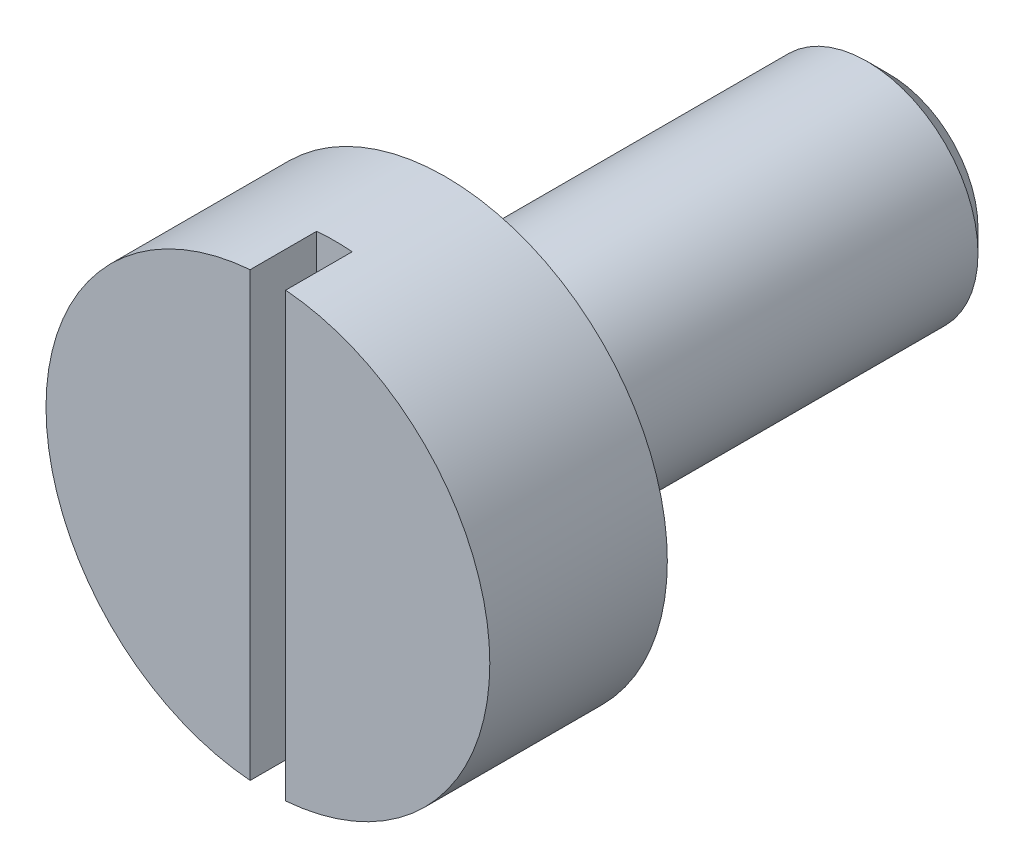
ISO-10303-21;
HEADER;
FILE_DESCRIPTION(('STEP AP214'),'2;1');
FILE_NAME('part.step','',(''),(''),'','','');
FILE_SCHEMA(('AUTOMOTIVE_DESIGN { 1 0 10303 214 1 1 1 1 }'));
ENDSEC;
DATA;
#1=APPLICATION_CONTEXT('core data for automotive mechanical design processes');
#2=APPLICATION_PROTOCOL_DEFINITION('international standard','automotive_design',2000,#1);
#3=PRODUCT_CONTEXT('',#1,'mechanical');
#4=PRODUCT('Part','Part','',(#3));
#5=PRODUCT_RELATED_PRODUCT_CATEGORY('part','',(#4));
#6=PRODUCT_DEFINITION_FORMATION('','',#4);
#7=PRODUCT_DEFINITION_CONTEXT('part definition',#1,'design');
#8=PRODUCT_DEFINITION('design','',#6,#7);
#9=PRODUCT_DEFINITION_SHAPE('','',#8);
#10=(LENGTH_UNIT() NAMED_UNIT(*) SI_UNIT(.MILLI.,.METRE.));
#11=(NAMED_UNIT(*) PLANE_ANGLE_UNIT() SI_UNIT($,.RADIAN.));
#12=(NAMED_UNIT(*) SI_UNIT($,.STERADIAN.) SOLID_ANGLE_UNIT());
#13=UNCERTAINTY_MEASURE_WITH_UNIT(LENGTH_MEASURE(1.E-05),#10,'distance_accuracy_value','');
#14=(GEOMETRIC_REPRESENTATION_CONTEXT(3) GLOBAL_UNCERTAINTY_ASSIGNED_CONTEXT((#13)) GLOBAL_UNIT_ASSIGNED_CONTEXT((#10,
#11,#12)) REPRESENTATION_CONTEXT('',''));
#15=CARTESIAN_POINT('',(0.,0.,0.));
#16=DIRECTION('',(0.,0.,1.));
#17=DIRECTION('',(1.,0.,0.));
#18=AXIS2_PLACEMENT_3D('',#15,#16,#17);
#19=CARTESIAN_POINT('',(0.,0.,14.));
#20=DIRECTION('',(0.,0.,1.));
#21=DIRECTION('',(1.,0.,0.));
#22=AXIS2_PLACEMENT_3D('',#19,#20,#21);
#23=PLANE('',#22);
#24=DIRECTION('',(0.,-1.,0.));
#25=VECTOR('',#24,1.);
#26=CARTESIAN_POINT('',(-0.399999999999999,0.,14.));
#27=LINE('',#26,#25);
#28=CARTESIAN_POINT('',(-0.399999999999999,4.98397431775085,14.));
#29=VERTEX_POINT('',#28);
#30=CARTESIAN_POINT('',(-0.399999999999999,-4.98397431775085,14.));
#31=VERTEX_POINT('',#30);
#32=EDGE_CURVE('E76',#29,#31,#27,.T.);
#33=ORIENTED_EDGE('',*,*,#32,.F.);
#34=CARTESIAN_POINT('',(0.,0.,14.));
#35=DIRECTION('',(0.,0.,1.));
#36=DIRECTION('',(1.,0.,0.));
#37=AXIS2_PLACEMENT_3D('',#34,#35,#36);
#38=CIRCLE('',#37,5.);
#39=EDGE_CURVE('E90',#29,#31,#38,.T.);
#40=ORIENTED_EDGE('',*,*,#39,.T.);
#41=EDGE_LOOP('',(#33,#40));
#42=FACE_BOUND('',#41,.T.);
#43=ADVANCED_FACE('F28',(#42),#23,.T.);
#44=CARTESIAN_POINT('',(0.,0.,10.));
#45=DIRECTION('',(0.,0.,-1.));
#46=DIRECTION('',(-1.,0.,0.));
#47=AXIS2_PLACEMENT_3D('',#44,#45,#46);
#48=CYLINDRICAL_SURFACE('',#47,2.5);
#49=CARTESIAN_POINT('',(0.,0.,0.499999999999999));
#50=DIRECTION('',(0.,0.,1.));
#51=DIRECTION('',(1.,0.,0.));
#52=AXIS2_PLACEMENT_3D('',#49,#50,#51);
#53=CIRCLE('',#52,2.5);
#54=CARTESIAN_POINT('',(2.5,0.,0.499999999999999));
#55=VERTEX_POINT('',#54);
#56=EDGE_CURVE('E36',#55,#55,#53,.T.);
#57=ORIENTED_EDGE('',*,*,#56,.T.);
#58=EDGE_LOOP('',(#57));
#59=FACE_BOUND('',#58,.T.);
#60=CARTESIAN_POINT('',(0.,0.,10.));
#61=DIRECTION('',(0.,0.,1.));
#62=DIRECTION('',(1.,0.,0.));
#63=AXIS2_PLACEMENT_3D('',#60,#61,#62);
#64=CIRCLE('',#63,2.5);
#65=CARTESIAN_POINT('',(2.5,0.,10.));
#66=VERTEX_POINT('',#65);
#67=EDGE_CURVE('E77',#66,#66,#64,.T.);
#68=ORIENTED_EDGE('',*,*,#67,.F.);
#69=EDGE_LOOP('',(#68));
#70=FACE_BOUND('',#69,.T.);
#71=ADVANCED_FACE('F30',(#59,#70),#48,.T.);
#72=CARTESIAN_POINT('',(0.,0.,0.));
#73=DIRECTION('',(0.,0.,1.));
#74=DIRECTION('',(1.,0.,0.));
#75=AXIS2_PLACEMENT_3D('',#72,#73,#74);
#76=PLANE('',#75);
#77=CARTESIAN_POINT('',(0.,0.,0.));
#78=DIRECTION('',(0.,0.,1.));
#79=DIRECTION('',(1.,0.,0.));
#80=AXIS2_PLACEMENT_3D('',#77,#78,#79);
#81=CIRCLE('',#80,2.);
#82=CARTESIAN_POINT('',(2.,0.,0.));
#83=VERTEX_POINT('',#82);
#84=EDGE_CURVE('E11',#83,#83,#81,.F.);
#85=ORIENTED_EDGE('',*,*,#84,.T.);
#86=EDGE_LOOP('',(#85));
#87=FACE_BOUND('',#86,.T.);
#88=ADVANCED_FACE('F126',(#87),#76,.F.);
#89=CARTESIAN_POINT('',(0.,0.,10.));
#90=DIRECTION('',(0.,0.,1.));
#91=DIRECTION('',(1.,0.,0.));
#92=AXIS2_PLACEMENT_3D('',#89,#90,#91);
#93=PLANE('',#92);
#94=CARTESIAN_POINT('',(0.,0.,10.));
#95=DIRECTION('',(0.,0.,1.));
#96=DIRECTION('',(1.,0.,0.));
#97=AXIS2_PLACEMENT_3D('',#94,#95,#96);
#98=CIRCLE('',#97,5.);
#99=CARTESIAN_POINT('',(5.,0.,10.));
#100=VERTEX_POINT('',#99);
#101=EDGE_CURVE('E91',#100,#100,#98,.T.);
#102=ORIENTED_EDGE('',*,*,#101,.F.);
#103=EDGE_LOOP('',(#102));
#104=FACE_BOUND('',#103,.T.);
#105=ORIENTED_EDGE('',*,*,#67,.T.);
#106=EDGE_LOOP('',(#105));
#107=FACE_BOUND('',#106,.T.);
#108=ADVANCED_FACE('F137',(#104,#107),#93,.F.);
#109=CARTESIAN_POINT('',(0.,0.,14.));
#110=DIRECTION('',(0.,0.,-1.));
#111=DIRECTION('',(-1.,0.,0.));
#112=AXIS2_PLACEMENT_3D('',#109,#110,#111);
#113=CYLINDRICAL_SURFACE('',#112,5.);
#114=ORIENTED_EDGE('',*,*,#39,.F.);
#115=DIRECTION('',(0.,0.,-1.));
#116=VECTOR('',#115,1.);
#117=CARTESIAN_POINT('',(-0.399999999999999,4.98397431775085,14.));
#118=LINE('',#117,#116);
#119=CARTESIAN_POINT('',(-0.399999999999999,4.98397431775085,12.5));
#120=VERTEX_POINT('',#119);
#121=EDGE_CURVE('E95',#29,#120,#118,.T.);
#122=ORIENTED_EDGE('',*,*,#121,.T.);
#123=CARTESIAN_POINT('',(0.,0.,12.5));
#124=DIRECTION('',(0.,0.,-1.));
#125=DIRECTION('',(-1.,0.,0.));
#126=AXIS2_PLACEMENT_3D('',#123,#124,#125);
#127=CIRCLE('',#126,5.);
#128=CARTESIAN_POINT('',(0.399999999999998,4.98397431775085,12.5));
#129=VERTEX_POINT('',#128);
#130=EDGE_CURVE('E86',#120,#129,#127,.T.);
#131=ORIENTED_EDGE('',*,*,#130,.T.);
#132=DIRECTION('',(0.,0.,-1.));
#133=VECTOR('',#132,1.);
#134=CARTESIAN_POINT('',(0.399999999999998,4.98397431775085,14.));
#135=LINE('',#134,#133);
#136=CARTESIAN_POINT('',(0.399999999999998,4.98397431775085,14.));
#137=VERTEX_POINT('',#136);
#138=EDGE_CURVE('E71',#129,#137,#135,.F.);
#139=ORIENTED_EDGE('',*,*,#138,.T.);
#140=CARTESIAN_POINT('',(0.400000000000001,-4.98397431775085,14.));
#141=VERTEX_POINT('',#140);
#142=EDGE_CURVE('E84',#141,#137,#38,.T.);
#143=ORIENTED_EDGE('',*,*,#142,.F.);
#144=DIRECTION('',(0.,0.,-1.));
#145=VECTOR('',#144,1.);
#146=CARTESIAN_POINT('',(0.400000000000001,-4.98397431775085,14.));
#147=LINE('',#146,#145);
#148=CARTESIAN_POINT('',(0.400000000000001,-4.98397431775085,12.5));
#149=VERTEX_POINT('',#148);
#150=EDGE_CURVE('E43',#141,#149,#147,.T.);
#151=ORIENTED_EDGE('',*,*,#150,.T.);
#152=CARTESIAN_POINT('',(-0.399999999999999,-4.98397431775085,12.5));
#153=VERTEX_POINT('',#152);
#154=EDGE_CURVE('E102',#149,#153,#127,.T.);
#155=ORIENTED_EDGE('',*,*,#154,.T.);
#156=DIRECTION('',(0.,0.,-1.));
#157=VECTOR('',#156,1.);
#158=CARTESIAN_POINT('',(-0.399999999999999,-4.98397431775085,14.));
#159=LINE('',#158,#157);
#160=EDGE_CURVE('E51',#153,#31,#159,.F.);
#161=ORIENTED_EDGE('',*,*,#160,.T.);
#162=EDGE_LOOP('',(#114,#122,#131,#139,#143,#151,#155,#161));
#163=FACE_BOUND('',#162,.T.);
#164=ORIENTED_EDGE('',*,*,#101,.T.);
#165=EDGE_LOOP('',(#164));
#166=FACE_BOUND('',#165,.T.);
#167=ADVANCED_FACE('F82',(#163,#166),#113,.T.);
#168=DIRECTION('',(0.,1.,0.));
#169=VECTOR('',#168,1.);
#170=CARTESIAN_POINT('',(0.4,0.,14.));
#171=LINE('',#170,#169);
#172=EDGE_CURVE('E68',#141,#137,#171,.T.);
#173=ORIENTED_EDGE('',*,*,#172,.F.);
#174=ORIENTED_EDGE('',*,*,#142,.T.);
#175=EDGE_LOOP('',(#173,#174));
#176=FACE_BOUND('',#175,.T.);
#177=ADVANCED_FACE('F89',(#176),#23,.T.);
#178=CARTESIAN_POINT('',(-0.399999999999999,5.79157588961515,12.5));
#179=DIRECTION('',(0.,0.,-1.));
#180=DIRECTION('',(-1.,0.,0.));
#181=AXIS2_PLACEMENT_3D('',#178,#179,#180);
#182=PLANE('',#181);
#183=DIRECTION('',(0.,-1.,0.));
#184=VECTOR('',#183,1.);
#185=CARTESIAN_POINT('',(-0.399999999999999,-5.61405632211728,12.5));
#186=LINE('',#185,#184);
#187=EDGE_CURVE('E202',#120,#153,#186,.T.);
#188=ORIENTED_EDGE('',*,*,#187,.T.);
#189=ORIENTED_EDGE('',*,*,#154,.F.);
#190=DIRECTION('',(0.,1.,0.));
#191=VECTOR('',#190,1.);
#192=CARTESIAN_POINT('',(0.400000000000001,-5.61405632211728,12.5));
#193=LINE('',#192,#191);
#194=EDGE_CURVE('E87',#149,#129,#193,.T.);
#195=ORIENTED_EDGE('',*,*,#194,.T.);
#196=ORIENTED_EDGE('',*,*,#130,.F.);
#197=EDGE_LOOP('',(#188,#189,#195,#196));
#198=FACE_BOUND('',#197,.T.);
#199=ADVANCED_FACE('F131',(#198),#182,.F.);
#200=CARTESIAN_POINT('',(-0.399999999999999,-5.61405632211728,12.5));
#201=DIRECTION('',(-1.,0.,0.));
#202=DIRECTION('',(0.,0.,1.));
#203=AXIS2_PLACEMENT_3D('',#200,#201,#202);
#204=PLANE('',#203);
#205=ORIENTED_EDGE('',*,*,#32,.T.);
#206=ORIENTED_EDGE('',*,*,#160,.F.);
#207=ORIENTED_EDGE('',*,*,#187,.F.);
#208=ORIENTED_EDGE('',*,*,#121,.F.);
#209=EDGE_LOOP('',(#205,#206,#207,#208));
#210=FACE_BOUND('',#209,.T.);
#211=ADVANCED_FACE('F116',(#210),#204,.F.);
#212=CARTESIAN_POINT('',(0.400000000000001,-5.61405632211728,12.5));
#213=DIRECTION('',(1.,0.,0.));
#214=DIRECTION('',(0.,1.,0.));
#215=AXIS2_PLACEMENT_3D('',#212,#213,#214);
#216=PLANE('',#215);
#217=ORIENTED_EDGE('',*,*,#172,.T.);
#218=ORIENTED_EDGE('',*,*,#138,.F.);
#219=ORIENTED_EDGE('',*,*,#194,.F.);
#220=ORIENTED_EDGE('',*,*,#150,.F.);
#221=EDGE_LOOP('',(#217,#218,#219,#220));
#222=FACE_BOUND('',#221,.T.);
#223=ADVANCED_FACE('F70',(#222),#216,.F.);
#224=CARTESIAN_POINT('',(0.,0.,0.499999999999999));
#225=DIRECTION('',(0.,0.,1.));
#226=DIRECTION('',(1.,0.,0.));
#227=AXIS2_PLACEMENT_3D('',#224,#225,#226);
#228=CONICAL_SURFACE('',#227,2.5,0.785398163397451);
#229=ORIENTED_EDGE('',*,*,#84,.F.);
#230=EDGE_LOOP('',(#229));
#231=FACE_BOUND('',#230,.T.);
#232=ORIENTED_EDGE('',*,*,#56,.F.);
#233=EDGE_LOOP('',(#232));
#234=FACE_BOUND('',#233,.T.);
#235=ADVANCED_FACE('F109',(#231,#234),#228,.T.);
#236=CLOSED_SHELL('',(#43,#71,#88,#108,#167,#177,#199,#211,#223,#235));
#237=MANIFOLD_SOLID_BREP('B2',#236);
#238=ADVANCED_BREP_SHAPE_REPRESENTATION('',(#18,#237),#14);
#239=SHAPE_DEFINITION_REPRESENTATION(#9,#238);
ENDSEC;
END-ISO-10303-21;
